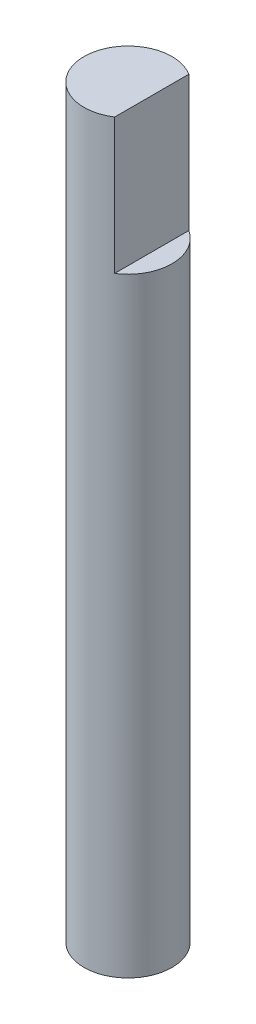
ISO-10303-21;
HEADER;
FILE_DESCRIPTION(('STEP AP214'),'2;1');
FILE_NAME('part.step','',(''),(''),'','','');
FILE_SCHEMA(('AUTOMOTIVE_DESIGN { 1 0 10303 214 1 1 1 1 }'));
ENDSEC;
DATA;
#1=APPLICATION_CONTEXT('core data for automotive mechanical design processes');
#2=APPLICATION_PROTOCOL_DEFINITION('international standard','automotive_design',2000,#1);
#3=PRODUCT_CONTEXT('',#1,'mechanical');
#4=PRODUCT('Part','Part','',(#3));
#5=PRODUCT_RELATED_PRODUCT_CATEGORY('part','',(#4));
#6=PRODUCT_DEFINITION_FORMATION('','',#4);
#7=PRODUCT_DEFINITION_CONTEXT('part definition',#1,'design');
#8=PRODUCT_DEFINITION('design','',#6,#7);
#9=PRODUCT_DEFINITION_SHAPE('','',#8);
#10=(LENGTH_UNIT() NAMED_UNIT(*) SI_UNIT(.MILLI.,.METRE.));
#11=(NAMED_UNIT(*) PLANE_ANGLE_UNIT() SI_UNIT($,.RADIAN.));
#12=(NAMED_UNIT(*) SI_UNIT($,.STERADIAN.) SOLID_ANGLE_UNIT());
#13=UNCERTAINTY_MEASURE_WITH_UNIT(LENGTH_MEASURE(1.E-05),#10,'distance_accuracy_value','');
#14=(GEOMETRIC_REPRESENTATION_CONTEXT(3) GLOBAL_UNCERTAINTY_ASSIGNED_CONTEXT((#13)) GLOBAL_UNIT_ASSIGNED_CONTEXT((#10,
#11,#12)) REPRESENTATION_CONTEXT('',''));
#15=CARTESIAN_POINT('',(0.,0.,0.));
#16=DIRECTION('',(0.,0.,1.));
#17=DIRECTION('',(1.,0.,0.));
#18=AXIS2_PLACEMENT_3D('',#15,#16,#17);
#19=CARTESIAN_POINT('',(0.,11.,0.));
#20=DIRECTION('',(0.,-1.,0.));
#21=DIRECTION('',(0.,0.,-1.));
#22=AXIS2_PLACEMENT_3D('',#19,#20,#21);
#23=CYLINDRICAL_SURFACE('',#22,0.65);
#24=CARTESIAN_POINT('',(0.,11.,0.));
#25=DIRECTION('',(0.,1.,0.));
#26=DIRECTION('',(0.,0.,1.));
#27=AXIS2_PLACEMENT_3D('',#24,#25,#26);
#28=CIRCLE('',#27,0.65);
#29=CARTESIAN_POINT('',(0.35,11.,-0.547722557505166));
#30=VERTEX_POINT('',#29);
#31=CARTESIAN_POINT('',(0.35,11.,0.547722557505166));
#32=VERTEX_POINT('',#31);
#33=EDGE_CURVE('E11',#30,#32,#28,.T.);
#34=ORIENTED_EDGE('',*,*,#33,.F.);
#35=DIRECTION('',(0.,1.,0.));
#36=VECTOR('',#35,1.);
#37=CARTESIAN_POINT('',(0.35,9.,-0.547722557505166));
#38=LINE('',#37,#36);
#39=CARTESIAN_POINT('',(0.35,9.,-0.547722557505166));
#40=VERTEX_POINT('',#39);
#41=EDGE_CURVE('E46',#40,#30,#38,.T.);
#42=ORIENTED_EDGE('',*,*,#41,.F.);
#43=CARTESIAN_POINT('',(0.,9.,0.));
#44=DIRECTION('',(0.,1.,0.));
#45=DIRECTION('',(0.,0.,1.));
#46=AXIS2_PLACEMENT_3D('',#43,#44,#45);
#47=CIRCLE('',#46,0.65);
#48=CARTESIAN_POINT('',(0.35,9.,0.547722557505166));
#49=VERTEX_POINT('',#48);
#50=EDGE_CURVE('E61',#49,#40,#47,.T.);
#51=ORIENTED_EDGE('',*,*,#50,.F.);
#52=DIRECTION('',(0.,1.,0.));
#53=VECTOR('',#52,1.);
#54=CARTESIAN_POINT('',(0.35,9.,0.547722557505166));
#55=LINE('',#54,#53);
#56=EDGE_CURVE('E52',#49,#32,#55,.T.);
#57=ORIENTED_EDGE('',*,*,#56,.T.);
#58=EDGE_LOOP('',(#34,#42,#51,#57));
#59=FACE_BOUND('',#58,.T.);
#60=CARTESIAN_POINT('',(0.,0.,0.));
#61=DIRECTION('',(0.,1.,0.));
#62=DIRECTION('',(0.,0.,1.));
#63=AXIS2_PLACEMENT_3D('',#60,#61,#62);
#64=CIRCLE('',#63,0.65);
#65=CARTESIAN_POINT('',(0.,0.,0.65));
#66=VERTEX_POINT('',#65);
#67=EDGE_CURVE('E35',#66,#66,#64,.T.);
#68=ORIENTED_EDGE('',*,*,#67,.T.);
#69=EDGE_LOOP('',(#68));
#70=FACE_BOUND('',#69,.T.);
#71=ADVANCED_FACE('F32',(#59,#70),#23,.T.);
#72=CARTESIAN_POINT('',(0.,11.,0.));
#73=DIRECTION('',(0.,1.,0.));
#74=DIRECTION('',(0.,0.,1.));
#75=AXIS2_PLACEMENT_3D('',#72,#73,#74);
#76=PLANE('',#75);
#77=DIRECTION('',(0.,0.,1.));
#78=VECTOR('',#77,1.);
#79=CARTESIAN_POINT('',(0.35,11.,0.));
#80=LINE('',#79,#78);
#81=EDGE_CURVE('E57',#30,#32,#80,.T.);
#82=ORIENTED_EDGE('',*,*,#81,.F.);
#83=ORIENTED_EDGE('',*,*,#33,.T.);
#84=EDGE_LOOP('',(#82,#83));
#85=FACE_BOUND('',#84,.T.);
#86=ADVANCED_FACE('F67',(#85),#76,.T.);
#87=CARTESIAN_POINT('',(0.,0.,0.));
#88=DIRECTION('',(0.,1.,0.));
#89=DIRECTION('',(0.,0.,1.));
#90=AXIS2_PLACEMENT_3D('',#87,#88,#89);
#91=PLANE('',#90);
#92=ORIENTED_EDGE('',*,*,#67,.F.);
#93=EDGE_LOOP('',(#92));
#94=FACE_BOUND('',#93,.T.);
#95=ADVANCED_FACE('F69',(#94),#91,.F.);
#96=CARTESIAN_POINT('',(0.35,9.,0.));
#97=DIRECTION('',(-1.,0.,0.));
#98=DIRECTION('',(0.,0.,1.));
#99=AXIS2_PLACEMENT_3D('',#96,#97,#98);
#100=PLANE('',#99);
#101=ORIENTED_EDGE('',*,*,#81,.T.);
#102=ORIENTED_EDGE('',*,*,#56,.F.);
#103=DIRECTION('',(0.,0.,1.));
#104=VECTOR('',#103,1.);
#105=CARTESIAN_POINT('',(0.35,9.,0.));
#106=LINE('',#105,#104);
#107=EDGE_CURVE('E84',#40,#49,#106,.T.);
#108=ORIENTED_EDGE('',*,*,#107,.F.);
#109=ORIENTED_EDGE('',*,*,#41,.T.);
#110=EDGE_LOOP('',(#101,#102,#108,#109));
#111=FACE_BOUND('',#110,.T.);
#112=ADVANCED_FACE('F58',(#111),#100,.F.);
#113=CARTESIAN_POINT('',(0.,9.,0.));
#114=DIRECTION('',(0.,1.,0.));
#115=DIRECTION('',(0.,0.,1.));
#116=AXIS2_PLACEMENT_3D('',#113,#114,#115);
#117=PLANE('',#116);
#118=ORIENTED_EDGE('',*,*,#50,.T.);
#119=ORIENTED_EDGE('',*,*,#107,.T.);
#120=EDGE_LOOP('',(#118,#119));
#121=FACE_BOUND('',#120,.T.);
#122=ADVANCED_FACE('F79',(#121),#117,.T.);
#123=CLOSED_SHELL('',(#71,#86,#95,#112,#122));
#124=MANIFOLD_SOLID_BREP('B2',#123);
#125=ADVANCED_BREP_SHAPE_REPRESENTATION('',(#18,#124),#14);
#126=SHAPE_DEFINITION_REPRESENTATION(#9,#125);
ENDSEC;
END-ISO-10303-21;
